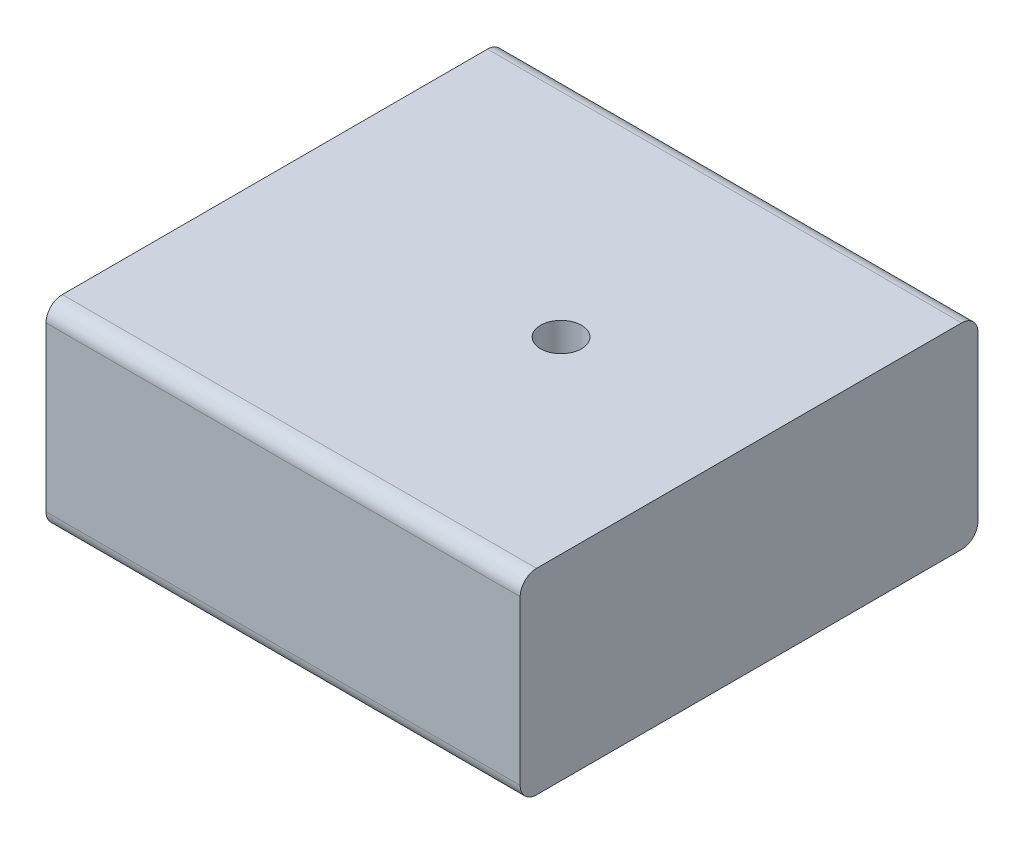
ISO-10303-21;
HEADER;
FILE_DESCRIPTION(('STEP AP214'),'2;1');
FILE_NAME('part.step','',(''),(''),'','','');
FILE_SCHEMA(('AUTOMOTIVE_DESIGN { 1 0 10303 214 1 1 1 1 }'));
ENDSEC;
DATA;
#1=APPLICATION_CONTEXT('core data for automotive mechanical design processes');
#2=APPLICATION_PROTOCOL_DEFINITION('international standard','automotive_design',2000,#1);
#3=PRODUCT_CONTEXT('',#1,'mechanical');
#4=PRODUCT('Part','Part','',(#3));
#5=PRODUCT_RELATED_PRODUCT_CATEGORY('part','',(#4));
#6=PRODUCT_DEFINITION_FORMATION('','',#4);
#7=PRODUCT_DEFINITION_CONTEXT('part definition',#1,'design');
#8=PRODUCT_DEFINITION('design','',#6,#7);
#9=PRODUCT_DEFINITION_SHAPE('','',#8);
#10=(LENGTH_UNIT() NAMED_UNIT(*) SI_UNIT(.MILLI.,.METRE.));
#11=(NAMED_UNIT(*) PLANE_ANGLE_UNIT() SI_UNIT($,.RADIAN.));
#12=(NAMED_UNIT(*) SI_UNIT($,.STERADIAN.) SOLID_ANGLE_UNIT());
#13=UNCERTAINTY_MEASURE_WITH_UNIT(LENGTH_MEASURE(1.E-05),#10,'distance_accuracy_value','');
#14=(GEOMETRIC_REPRESENTATION_CONTEXT(3) GLOBAL_UNCERTAINTY_ASSIGNED_CONTEXT((#13)) GLOBAL_UNIT_ASSIGNED_CONTEXT((#10,
#11,#12)) REPRESENTATION_CONTEXT('',''));
#15=CARTESIAN_POINT('',(0.,0.,0.));
#16=DIRECTION('',(0.,0.,1.));
#17=DIRECTION('',(1.,0.,0.));
#18=AXIS2_PLACEMENT_3D('',#15,#16,#17);
#19=CARTESIAN_POINT('',(-46.0375,38.1,88.9));
#20=DIRECTION('',(1.,0.,0.));
#21=DIRECTION('',(0.,0.,-1.));
#22=AXIS2_PLACEMENT_3D('',#19,#20,#21);
#23=PLANE('',#22);
#24=DIRECTION('',(0.,-1.,0.));
#25=VECTOR('',#24,1.);
#26=CARTESIAN_POINT('',(-46.0375,38.1,0.));
#27=LINE('',#26,#25);
#28=CARTESIAN_POINT('',(-46.0375,34.925,0.));
#29=VERTEX_POINT('',#28);
#30=CARTESIAN_POINT('',(-46.0375,3.17500000000001,0.));
#31=VERTEX_POINT('',#30);
#32=EDGE_CURVE('E166',#29,#31,#27,.T.);
#33=ORIENTED_EDGE('',*,*,#32,.T.);
#34=CARTESIAN_POINT('',(-46.0375,3.175,3.175));
#35=DIRECTION('',(1.,0.,0.));
#36=DIRECTION('',(0.,0.,-1.));
#37=AXIS2_PLACEMENT_3D('',#34,#35,#36);
#38=CIRCLE('',#37,3.175);
#39=CARTESIAN_POINT('',(-46.0375,0.,3.175));
#40=VERTEX_POINT('',#39);
#41=EDGE_CURVE('E140',#31,#40,#38,.F.);
#42=ORIENTED_EDGE('',*,*,#41,.T.);
#43=DIRECTION('',(0.,0.,-1.));
#44=VECTOR('',#43,1.);
#45=CARTESIAN_POINT('',(-46.0375,0.,88.9));
#46=LINE('',#45,#44);
#47=CARTESIAN_POINT('',(-46.0375,0.,85.725));
#48=VERTEX_POINT('',#47);
#49=EDGE_CURVE('E119',#48,#40,#46,.T.);
#50=ORIENTED_EDGE('',*,*,#49,.F.);
#51=CARTESIAN_POINT('',(-46.0375,3.175,85.725));
#52=DIRECTION('',(1.,0.,0.));
#53=DIRECTION('',(0.,0.,-1.));
#54=AXIS2_PLACEMENT_3D('',#51,#52,#53);
#55=CIRCLE('',#54,3.175);
#56=CARTESIAN_POINT('',(-46.0375,3.17500000000001,88.9));
#57=VERTEX_POINT('',#56);
#58=EDGE_CURVE('E124',#48,#57,#55,.F.);
#59=ORIENTED_EDGE('',*,*,#58,.T.);
#60=DIRECTION('',(0.,-1.,0.));
#61=VECTOR('',#60,1.);
#62=CARTESIAN_POINT('',(-46.0375,38.1,88.9));
#63=LINE('',#62,#61);
#64=CARTESIAN_POINT('',(-46.0375,34.925,88.9));
#65=VERTEX_POINT('',#64);
#66=EDGE_CURVE('E161',#65,#57,#63,.T.);
#67=ORIENTED_EDGE('',*,*,#66,.F.);
#68=CARTESIAN_POINT('',(-46.0375,34.925,85.725));
#69=DIRECTION('',(1.,0.,0.));
#70=DIRECTION('',(0.,0.,-1.));
#71=AXIS2_PLACEMENT_3D('',#68,#69,#70);
#72=CIRCLE('',#71,3.175);
#73=CARTESIAN_POINT('',(-46.0375,38.1,85.725));
#74=VERTEX_POINT('',#73);
#75=EDGE_CURVE('E54',#65,#74,#72,.F.);
#76=ORIENTED_EDGE('',*,*,#75,.T.);
#77=DIRECTION('',(0.,0.,-1.));
#78=VECTOR('',#77,1.);
#79=CARTESIAN_POINT('',(-46.0375,38.1,88.9));
#80=LINE('',#79,#78);
#81=CARTESIAN_POINT('',(-46.0375,38.1,3.175));
#82=VERTEX_POINT('',#81);
#83=EDGE_CURVE('E151',#74,#82,#80,.T.);
#84=ORIENTED_EDGE('',*,*,#83,.T.);
#85=CARTESIAN_POINT('',(-46.0375,34.925,3.175));
#86=DIRECTION('',(1.,0.,0.));
#87=DIRECTION('',(0.,0.,-1.));
#88=AXIS2_PLACEMENT_3D('',#85,#86,#87);
#89=CIRCLE('',#88,3.175);
#90=EDGE_CURVE('E47',#82,#29,#89,.F.);
#91=ORIENTED_EDGE('',*,*,#90,.T.);
#92=EDGE_LOOP('',(#33,#42,#50,#59,#67,#76,#84,#91));
#93=FACE_BOUND('',#92,.T.);
#94=ADVANCED_FACE('F32',(#93),#23,.F.);
#95=CARTESIAN_POINT('',(-46.0375,0.,88.9));
#96=DIRECTION('',(0.,1.,0.));
#97=DIRECTION('',(-1.,0.,0.));
#98=AXIS2_PLACEMENT_3D('',#95,#96,#97);
#99=PLANE('',#98);
#100=CARTESIAN_POINT('',(9.52500000000001,0.,44.45));
#101=DIRECTION('',(0.,1.,0.));
#102=DIRECTION('',(-1.,0.,0.));
#103=AXIS2_PLACEMENT_3D('',#100,#101,#102);
#104=CIRCLE('',#103,3.96874999999999);
#105=CARTESIAN_POINT('',(5.55625000000002,0.,44.45));
#106=VERTEX_POINT('',#105);
#107=EDGE_CURVE('E169',#106,#106,#104,.T.);
#108=ORIENTED_EDGE('',*,*,#107,.T.);
#109=EDGE_LOOP('',(#108));
#110=FACE_BOUND('',#109,.T.);
#111=ORIENTED_EDGE('',*,*,#49,.T.);
#112=DIRECTION('',(1.,0.,0.));
#113=VECTOR('',#112,1.);
#114=CARTESIAN_POINT('',(-46.0375,0.,3.175));
#115=LINE('',#114,#113);
#116=CARTESIAN_POINT('',(46.0375,0.,3.175));
#117=VERTEX_POINT('',#116);
#118=EDGE_CURVE('E118',#40,#117,#115,.T.);
#119=ORIENTED_EDGE('',*,*,#118,.T.);
#120=DIRECTION('',(0.,0.,-1.));
#121=VECTOR('',#120,1.);
#122=CARTESIAN_POINT('',(46.0375,0.,88.9));
#123=LINE('',#122,#121);
#124=CARTESIAN_POINT('',(46.0375,0.,85.725));
#125=VERTEX_POINT('',#124);
#126=EDGE_CURVE('E101',#125,#117,#123,.T.);
#127=ORIENTED_EDGE('',*,*,#126,.F.);
#128=DIRECTION('',(1.,0.,0.));
#129=VECTOR('',#128,1.);
#130=CARTESIAN_POINT('',(-46.0375,0.,85.725));
#131=LINE('',#130,#129);
#132=EDGE_CURVE('E115',#125,#48,#131,.F.);
#133=ORIENTED_EDGE('',*,*,#132,.T.);
#134=EDGE_LOOP('',(#111,#119,#127,#133));
#135=FACE_BOUND('',#134,.T.);
#136=ADVANCED_FACE('F114',(#110,#135),#99,.F.);
#137=CARTESIAN_POINT('',(46.0375,38.1,88.9));
#138=DIRECTION('',(-1.,0.,0.));
#139=DIRECTION('',(0.,-1.,0.));
#140=AXIS2_PLACEMENT_3D('',#137,#138,#139);
#141=PLANE('',#140);
#142=ORIENTED_EDGE('',*,*,#126,.T.);
#143=CARTESIAN_POINT('',(46.0375,3.17500000000002,3.175));
#144=DIRECTION('',(-1.,0.,0.));
#145=DIRECTION('',(0.,-1.,0.));
#146=AXIS2_PLACEMENT_3D('',#143,#144,#145);
#147=CIRCLE('',#146,3.175);
#148=CARTESIAN_POINT('',(46.0375,3.17500000000003,0.));
#149=VERTEX_POINT('',#148);
#150=EDGE_CURVE('E108',#117,#149,#147,.F.);
#151=ORIENTED_EDGE('',*,*,#150,.T.);
#152=DIRECTION('',(0.,1.,0.));
#153=VECTOR('',#152,1.);
#154=CARTESIAN_POINT('',(46.0375,38.1,0.));
#155=LINE('',#154,#153);
#156=CARTESIAN_POINT('',(46.0375,34.925,0.));
#157=VERTEX_POINT('',#156);
#158=EDGE_CURVE('E163',#149,#157,#155,.T.);
#159=ORIENTED_EDGE('',*,*,#158,.T.);
#160=CARTESIAN_POINT('',(46.0375,34.925,3.175));
#161=DIRECTION('',(-1.,0.,0.));
#162=DIRECTION('',(0.,-1.,0.));
#163=AXIS2_PLACEMENT_3D('',#160,#161,#162);
#164=CIRCLE('',#163,3.175);
#165=CARTESIAN_POINT('',(46.0375,38.1,3.175));
#166=VERTEX_POINT('',#165);
#167=EDGE_CURVE('E109',#157,#166,#164,.F.);
#168=ORIENTED_EDGE('',*,*,#167,.T.);
#169=DIRECTION('',(0.,0.,-1.));
#170=VECTOR('',#169,1.);
#171=CARTESIAN_POINT('',(46.0375,38.1,88.9));
#172=LINE('',#171,#170);
#173=CARTESIAN_POINT('',(46.0375,38.1,85.725));
#174=VERTEX_POINT('',#173);
#175=EDGE_CURVE('E120',#174,#166,#172,.T.);
#176=ORIENTED_EDGE('',*,*,#175,.F.);
#177=CARTESIAN_POINT('',(46.0375,34.925,85.725));
#178=DIRECTION('',(-1.,0.,0.));
#179=DIRECTION('',(0.,-1.,0.));
#180=AXIS2_PLACEMENT_3D('',#177,#178,#179);
#181=CIRCLE('',#180,3.175);
#182=CARTESIAN_POINT('',(46.0375,34.925,88.9));
#183=VERTEX_POINT('',#182);
#184=EDGE_CURVE('E126',#174,#183,#181,.F.);
#185=ORIENTED_EDGE('',*,*,#184,.T.);
#186=DIRECTION('',(0.,1.,0.));
#187=VECTOR('',#186,1.);
#188=CARTESIAN_POINT('',(46.0375,38.1,88.9));
#189=LINE('',#188,#187);
#190=CARTESIAN_POINT('',(46.0375,3.17500000000003,88.9));
#191=VERTEX_POINT('',#190);
#192=EDGE_CURVE('E103',#191,#183,#189,.T.);
#193=ORIENTED_EDGE('',*,*,#192,.F.);
#194=CARTESIAN_POINT('',(46.0375,3.17500000000002,85.725));
#195=DIRECTION('',(-1.,0.,0.));
#196=DIRECTION('',(0.,-1.,0.));
#197=AXIS2_PLACEMENT_3D('',#194,#195,#196);
#198=CIRCLE('',#197,3.175);
#199=EDGE_CURVE('E98',#191,#125,#198,.F.);
#200=ORIENTED_EDGE('',*,*,#199,.T.);
#201=EDGE_LOOP('',(#142,#151,#159,#168,#176,#185,#193,#200));
#202=FACE_BOUND('',#201,.T.);
#203=ADVANCED_FACE('F100',(#202),#141,.F.);
#204=CARTESIAN_POINT('',(-46.0375,38.1,88.9));
#205=DIRECTION('',(0.,-1.,0.));
#206=DIRECTION('',(1.,0.,0.));
#207=AXIS2_PLACEMENT_3D('',#204,#205,#206);
#208=PLANE('',#207);
#209=CARTESIAN_POINT('',(9.52500000000001,38.1,44.45));
#210=DIRECTION('',(0.,1.,0.));
#211=DIRECTION('',(0.,0.,1.));
#212=AXIS2_PLACEMENT_3D('',#209,#210,#211);
#213=CIRCLE('',#212,3.96874999999999);
#214=CARTESIAN_POINT('',(9.52500000000001,38.1,48.41875));
#215=VERTEX_POINT('',#214);
#216=EDGE_CURVE('E277',#215,#215,#213,.T.);
#217=ORIENTED_EDGE('',*,*,#216,.F.);
#218=EDGE_LOOP('',(#217));
#219=FACE_BOUND('',#218,.T.);
#220=ORIENTED_EDGE('',*,*,#175,.T.);
#221=DIRECTION('',(-1.,0.,0.));
#222=VECTOR('',#221,1.);
#223=CARTESIAN_POINT('',(-46.0375,38.1,3.175));
#224=LINE('',#223,#222);
#225=EDGE_CURVE('E11',#166,#82,#224,.T.);
#226=ORIENTED_EDGE('',*,*,#225,.T.);
#227=ORIENTED_EDGE('',*,*,#83,.F.);
#228=DIRECTION('',(-1.,0.,0.));
#229=VECTOR('',#228,1.);
#230=CARTESIAN_POINT('',(46.0375,38.1,85.725));
#231=LINE('',#230,#229);
#232=EDGE_CURVE('E40',#74,#174,#231,.F.);
#233=ORIENTED_EDGE('',*,*,#232,.T.);
#234=EDGE_LOOP('',(#220,#226,#227,#233));
#235=FACE_BOUND('',#234,.T.);
#236=ADVANCED_FACE('F150',(#219,#235),#208,.F.);
#237=CARTESIAN_POINT('',(0.,0.,88.9));
#238=DIRECTION('',(0.,0.,1.));
#239=DIRECTION('',(1.,0.,0.));
#240=AXIS2_PLACEMENT_3D('',#237,#238,#239);
#241=PLANE('',#240);
#242=ORIENTED_EDGE('',*,*,#66,.T.);
#243=DIRECTION('',(1.,0.,0.));
#244=VECTOR('',#243,1.);
#245=CARTESIAN_POINT('',(46.0375,3.17500000000002,88.9));
#246=LINE('',#245,#244);
#247=EDGE_CURVE('E145',#57,#191,#246,.T.);
#248=ORIENTED_EDGE('',*,*,#247,.T.);
#249=ORIENTED_EDGE('',*,*,#192,.T.);
#250=DIRECTION('',(-1.,0.,0.));
#251=VECTOR('',#250,1.);
#252=CARTESIAN_POINT('',(-46.0375,34.925,88.9));
#253=LINE('',#252,#251);
#254=EDGE_CURVE('E142',#183,#65,#253,.T.);
#255=ORIENTED_EDGE('',*,*,#254,.T.);
#256=EDGE_LOOP('',(#242,#248,#249,#255));
#257=FACE_BOUND('',#256,.T.);
#258=ADVANCED_FACE('F160',(#257),#241,.T.);
#259=CARTESIAN_POINT('',(0.,0.,0.));
#260=DIRECTION('',(0.,0.,1.));
#261=DIRECTION('',(1.,0.,0.));
#262=AXIS2_PLACEMENT_3D('',#259,#260,#261);
#263=PLANE('',#262);
#264=ORIENTED_EDGE('',*,*,#158,.F.);
#265=DIRECTION('',(1.,0.,0.));
#266=VECTOR('',#265,1.);
#267=CARTESIAN_POINT('',(0.,3.17500000000001,0.));
#268=LINE('',#267,#266);
#269=EDGE_CURVE('E135',#149,#31,#268,.F.);
#270=ORIENTED_EDGE('',*,*,#269,.T.);
#271=ORIENTED_EDGE('',*,*,#32,.F.);
#272=DIRECTION('',(-1.,0.,0.));
#273=VECTOR('',#272,1.);
#274=CARTESIAN_POINT('',(0.,34.925,0.));
#275=LINE('',#274,#273);
#276=EDGE_CURVE('E133',#29,#157,#275,.F.);
#277=ORIENTED_EDGE('',*,*,#276,.T.);
#278=EDGE_LOOP('',(#264,#270,#271,#277));
#279=FACE_BOUND('',#278,.T.);
#280=ADVANCED_FACE('F177',(#279),#263,.F.);
#281=CARTESIAN_POINT('',(-46.0375,3.175,3.175));
#282=DIRECTION('',(1.,0.,0.));
#283=DIRECTION('',(0.,1.,0.));
#284=AXIS2_PLACEMENT_3D('',#281,#282,#283);
#285=CYLINDRICAL_SURFACE('',#284,3.175);
#286=ORIENTED_EDGE('',*,*,#41,.F.);
#287=ORIENTED_EDGE('',*,*,#269,.F.);
#288=ORIENTED_EDGE('',*,*,#150,.F.);
#289=ORIENTED_EDGE('',*,*,#118,.F.);
#290=EDGE_LOOP('',(#286,#287,#288,#289));
#291=FACE_BOUND('',#290,.T.);
#292=ADVANCED_FACE('F186',(#291),#285,.T.);
#293=CARTESIAN_POINT('',(0.,3.17500000000001,85.725));
#294=DIRECTION('',(-1.,0.,0.));
#295=DIRECTION('',(0.,-1.,0.));
#296=AXIS2_PLACEMENT_3D('',#293,#294,#295);
#297=CYLINDRICAL_SURFACE('',#296,3.175);
#298=ORIENTED_EDGE('',*,*,#58,.F.);
#299=ORIENTED_EDGE('',*,*,#132,.F.);
#300=ORIENTED_EDGE('',*,*,#199,.F.);
#301=ORIENTED_EDGE('',*,*,#247,.F.);
#302=EDGE_LOOP('',(#298,#299,#300,#301));
#303=FACE_BOUND('',#302,.T.);
#304=ADVANCED_FACE('F123',(#303),#297,.T.);
#305=CARTESIAN_POINT('',(-46.0375,34.925,3.175));
#306=DIRECTION('',(-1.,0.,0.));
#307=DIRECTION('',(0.,-1.,0.));
#308=AXIS2_PLACEMENT_3D('',#305,#306,#307);
#309=CYLINDRICAL_SURFACE('',#308,3.175);
#310=ORIENTED_EDGE('',*,*,#167,.F.);
#311=ORIENTED_EDGE('',*,*,#276,.F.);
#312=ORIENTED_EDGE('',*,*,#90,.F.);
#313=ORIENTED_EDGE('',*,*,#225,.F.);
#314=EDGE_LOOP('',(#310,#311,#312,#313));
#315=FACE_BOUND('',#314,.T.);
#316=ADVANCED_FACE('F179',(#315),#309,.T.);
#317=CARTESIAN_POINT('',(0.,34.925,85.725));
#318=DIRECTION('',(1.,0.,0.));
#319=DIRECTION('',(0.,1.,0.));
#320=AXIS2_PLACEMENT_3D('',#317,#318,#319);
#321=CYLINDRICAL_SURFACE('',#320,3.175);
#322=ORIENTED_EDGE('',*,*,#184,.F.);
#323=ORIENTED_EDGE('',*,*,#232,.F.);
#324=ORIENTED_EDGE('',*,*,#75,.F.);
#325=ORIENTED_EDGE('',*,*,#254,.F.);
#326=EDGE_LOOP('',(#322,#323,#324,#325));
#327=FACE_BOUND('',#326,.T.);
#328=ADVANCED_FACE('F34',(#327),#321,.T.);
#329=CARTESIAN_POINT('',(9.52500000000001,38.1,44.45));
#330=DIRECTION('',(0.,1.,0.));
#331=DIRECTION('',(0.,0.,1.));
#332=AXIS2_PLACEMENT_3D('',#329,#330,#331);
#333=CYLINDRICAL_SURFACE('',#332,3.96874999999999);
#334=ORIENTED_EDGE('',*,*,#107,.F.);
#335=EDGE_LOOP('',(#334));
#336=FACE_BOUND('',#335,.T.);
#337=ORIENTED_EDGE('',*,*,#216,.T.);
#338=EDGE_LOOP('',(#337));
#339=FACE_BOUND('',#338,.T.);
#340=ADVANCED_FACE('F185',(#336,#339),#333,.F.);
#341=CLOSED_SHELL('',(#94,#136,#203,#236,#258,#280,#292,#304,#316,#328,#340));
#342=MANIFOLD_SOLID_BREP('B2',#341);
#343=ADVANCED_BREP_SHAPE_REPRESENTATION('',(#18,#342),#14);
#344=SHAPE_DEFINITION_REPRESENTATION(#9,#343);
ENDSEC;
END-ISO-10303-21;
